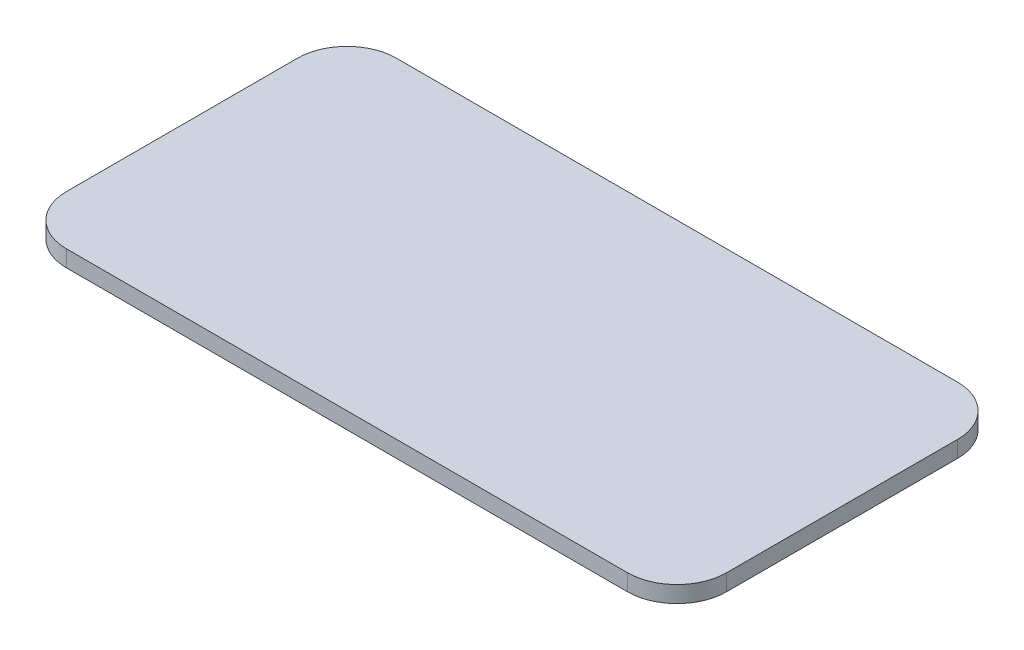
ISO-10303-21;
HEADER;
FILE_DESCRIPTION(('STEP AP214'),'2;1');
FILE_NAME('part.step','',(''),(''),'','','');
FILE_SCHEMA(('AUTOMOTIVE_DESIGN { 1 0 10303 214 1 1 1 1 }'));
ENDSEC;
DATA;
#1=APPLICATION_CONTEXT('core data for automotive mechanical design processes');
#2=APPLICATION_PROTOCOL_DEFINITION('international standard','automotive_design',2000,#1);
#3=PRODUCT_CONTEXT('',#1,'mechanical');
#4=PRODUCT('Part','Part','',(#3));
#5=PRODUCT_RELATED_PRODUCT_CATEGORY('part','',(#4));
#6=PRODUCT_DEFINITION_FORMATION('','',#4);
#7=PRODUCT_DEFINITION_CONTEXT('part definition',#1,'design');
#8=PRODUCT_DEFINITION('design','',#6,#7);
#9=PRODUCT_DEFINITION_SHAPE('','',#8);
#10=(LENGTH_UNIT() NAMED_UNIT(*) SI_UNIT(.MILLI.,.METRE.));
#11=(NAMED_UNIT(*) PLANE_ANGLE_UNIT() SI_UNIT($,.RADIAN.));
#12=(NAMED_UNIT(*) SI_UNIT($,.STERADIAN.) SOLID_ANGLE_UNIT());
#13=UNCERTAINTY_MEASURE_WITH_UNIT(LENGTH_MEASURE(1.E-05),#10,'distance_accuracy_value','');
#14=(GEOMETRIC_REPRESENTATION_CONTEXT(3) GLOBAL_UNCERTAINTY_ASSIGNED_CONTEXT((#13)) GLOBAL_UNIT_ASSIGNED_CONTEXT((#10,
#11,#12)) REPRESENTATION_CONTEXT('',''));
#15=CARTESIAN_POINT('',(0.,0.,0.));
#16=DIRECTION('',(0.,0.,1.));
#17=DIRECTION('',(1.,0.,0.));
#18=AXIS2_PLACEMENT_3D('',#15,#16,#17);
#19=CARTESIAN_POINT('',(0.,0.,0.));
#20=DIRECTION('',(0.,1.,0.));
#21=DIRECTION('',(0.,0.,1.));
#22=AXIS2_PLACEMENT_3D('',#19,#20,#21);
#23=PLANE('',#22);
#24=DIRECTION('',(-1.,0.,0.));
#25=VECTOR('',#24,1.);
#26=CARTESIAN_POINT('',(-95.015,0.,-45.015));
#27=LINE('',#26,#25);
#28=CARTESIAN_POINT('',(80.015,0.,-45.015));
#29=VERTEX_POINT('',#28);
#30=CARTESIAN_POINT('',(-80.015,0.,-45.015));
#31=VERTEX_POINT('',#30);
#32=EDGE_CURVE('E390',#29,#31,#27,.T.);
#33=ORIENTED_EDGE('',*,*,#32,.F.);
#34=CARTESIAN_POINT('',(80.015,0.,-30.015));
#35=DIRECTION('',(0.,1.,0.));
#36=DIRECTION('',(0.,0.,1.));
#37=AXIS2_PLACEMENT_3D('',#34,#35,#36);
#38=CIRCLE('',#37,15.);
#39=CARTESIAN_POINT('',(95.015,0.,-30.015));
#40=VERTEX_POINT('',#39);
#41=EDGE_CURVE('E11',#29,#40,#38,.F.);
#42=ORIENTED_EDGE('',*,*,#41,.T.);
#43=DIRECTION('',(0.,0.,-1.));
#44=VECTOR('',#43,1.);
#45=CARTESIAN_POINT('',(95.015,0.,-45.015));
#46=LINE('',#45,#44);
#47=CARTESIAN_POINT('',(95.015,0.,30.015));
#48=VERTEX_POINT('',#47);
#49=EDGE_CURVE('E402',#48,#40,#46,.T.);
#50=ORIENTED_EDGE('',*,*,#49,.F.);
#51=CARTESIAN_POINT('',(80.015,0.,30.015));
#52=DIRECTION('',(0.,1.,0.));
#53=DIRECTION('',(0.,0.,1.));
#54=AXIS2_PLACEMENT_3D('',#51,#52,#53);
#55=CIRCLE('',#54,15.);
#56=CARTESIAN_POINT('',(80.015,0.,45.015));
#57=VERTEX_POINT('',#56);
#58=EDGE_CURVE('E221',#48,#57,#55,.F.);
#59=ORIENTED_EDGE('',*,*,#58,.T.);
#60=DIRECTION('',(1.,0.,0.));
#61=VECTOR('',#60,1.);
#62=CARTESIAN_POINT('',(-95.015,0.,45.015));
#63=LINE('',#62,#61);
#64=CARTESIAN_POINT('',(-80.015,0.,45.015));
#65=VERTEX_POINT('',#64);
#66=EDGE_CURVE('E250',#65,#57,#63,.T.);
#67=ORIENTED_EDGE('',*,*,#66,.F.);
#68=CARTESIAN_POINT('',(-80.015,0.,30.015));
#69=DIRECTION('',(0.,1.,0.));
#70=DIRECTION('',(0.,0.,1.));
#71=AXIS2_PLACEMENT_3D('',#68,#69,#70);
#72=CIRCLE('',#71,15.);
#73=CARTESIAN_POINT('',(-95.015,0.,30.015));
#74=VERTEX_POINT('',#73);
#75=EDGE_CURVE('E383',#65,#74,#72,.F.);
#76=ORIENTED_EDGE('',*,*,#75,.T.);
#77=DIRECTION('',(0.,0.,1.));
#78=VECTOR('',#77,1.);
#79=CARTESIAN_POINT('',(-95.015,0.,-45.015));
#80=LINE('',#79,#78);
#81=CARTESIAN_POINT('',(-95.015,0.,-30.015));
#82=VERTEX_POINT('',#81);
#83=EDGE_CURVE('E392',#82,#74,#80,.T.);
#84=ORIENTED_EDGE('',*,*,#83,.F.);
#85=CARTESIAN_POINT('',(-80.015,0.,-30.015));
#86=DIRECTION('',(0.,1.,0.));
#87=DIRECTION('',(0.,0.,1.));
#88=AXIS2_PLACEMENT_3D('',#85,#86,#87);
#89=CIRCLE('',#88,15.);
#90=EDGE_CURVE('E57',#82,#31,#89,.F.);
#91=ORIENTED_EDGE('',*,*,#90,.T.);
#92=EDGE_LOOP('',(#33,#42,#50,#59,#67,#76,#84,#91));
#93=FACE_BOUND('',#92,.T.);
#94=DIRECTION('',(1.,0.,0.));
#95=VECTOR('',#94,1.);
#96=CARTESIAN_POINT('',(-92.015,0.,42.015));
#97=LINE('',#96,#95);
#98=CARTESIAN_POINT('',(-77.015,0.,42.015));
#99=VERTEX_POINT('',#98);
#100=CARTESIAN_POINT('',(77.015,0.,42.015));
#101=VERTEX_POINT('',#100);
#102=EDGE_CURVE('E215',#99,#101,#97,.T.);
#103=ORIENTED_EDGE('',*,*,#102,.T.);
#104=CARTESIAN_POINT('',(77.015,0.,27.015));
#105=DIRECTION('',(0.,1.,0.));
#106=DIRECTION('',(0.,0.,1.));
#107=AXIS2_PLACEMENT_3D('',#104,#105,#106);
#108=CIRCLE('',#107,15.);
#109=CARTESIAN_POINT('',(92.015,0.,27.015));
#110=VERTEX_POINT('',#109);
#111=EDGE_CURVE('E211',#101,#110,#108,.T.);
#112=ORIENTED_EDGE('',*,*,#111,.T.);
#113=DIRECTION('',(0.,0.,-1.));
#114=VECTOR('',#113,1.);
#115=CARTESIAN_POINT('',(92.015,0.,42.015));
#116=LINE('',#115,#114);
#117=CARTESIAN_POINT('',(92.015,0.,-27.015));
#118=VERTEX_POINT('',#117);
#119=EDGE_CURVE('E213',#110,#118,#116,.T.);
#120=ORIENTED_EDGE('',*,*,#119,.T.);
#121=CARTESIAN_POINT('',(77.015,0.,-27.015));
#122=DIRECTION('',(0.,1.,0.));
#123=DIRECTION('',(0.,0.,1.));
#124=AXIS2_PLACEMENT_3D('',#121,#122,#123);
#125=CIRCLE('',#124,15.);
#126=CARTESIAN_POINT('',(77.015,0.,-42.015));
#127=VERTEX_POINT('',#126);
#128=EDGE_CURVE('E361',#118,#127,#125,.T.);
#129=ORIENTED_EDGE('',*,*,#128,.T.);
#130=DIRECTION('',(-1.,0.,0.));
#131=VECTOR('',#130,1.);
#132=CARTESIAN_POINT('',(-92.015,0.,-42.015));
#133=LINE('',#132,#131);
#134=CARTESIAN_POINT('',(-77.015,0.,-42.015));
#135=VERTEX_POINT('',#134);
#136=EDGE_CURVE('E233',#127,#135,#133,.T.);
#137=ORIENTED_EDGE('',*,*,#136,.T.);
#138=CARTESIAN_POINT('',(-77.015,0.,-27.015));
#139=DIRECTION('',(0.,1.,0.));
#140=DIRECTION('',(0.,0.,1.));
#141=AXIS2_PLACEMENT_3D('',#138,#139,#140);
#142=CIRCLE('',#141,15.);
#143=CARTESIAN_POINT('',(-92.015,0.,-27.015));
#144=VERTEX_POINT('',#143);
#145=EDGE_CURVE('E367',#135,#144,#142,.T.);
#146=ORIENTED_EDGE('',*,*,#145,.T.);
#147=DIRECTION('',(0.,0.,1.));
#148=VECTOR('',#147,1.);
#149=CARTESIAN_POINT('',(-92.015,0.,42.015));
#150=LINE('',#149,#148);
#151=CARTESIAN_POINT('',(-92.015,0.,27.015));
#152=VERTEX_POINT('',#151);
#153=EDGE_CURVE('E439',#144,#152,#150,.T.);
#154=ORIENTED_EDGE('',*,*,#153,.T.);
#155=CARTESIAN_POINT('',(-77.015,0.,27.015));
#156=DIRECTION('',(0.,1.,0.));
#157=DIRECTION('',(0.,0.,1.));
#158=AXIS2_PLACEMENT_3D('',#155,#156,#157);
#159=CIRCLE('',#158,15.);
#160=EDGE_CURVE('E373',#152,#99,#159,.T.);
#161=ORIENTED_EDGE('',*,*,#160,.T.);
#162=EDGE_LOOP('',(#103,#112,#120,#129,#137,#146,#154,#161));
#163=FACE_BOUND('',#162,.T.);
#164=ADVANCED_FACE('F48',(#93,#163),#23,.F.);
#165=CARTESIAN_POINT('',(95.015,4.,-45.015));
#166=DIRECTION('',(-1.,0.,0.));
#167=DIRECTION('',(0.,0.,1.));
#168=AXIS2_PLACEMENT_3D('',#165,#166,#167);
#169=PLANE('',#168);
#170=ORIENTED_EDGE('',*,*,#49,.T.);
#171=DIRECTION('',(0.,-1.,0.));
#172=VECTOR('',#171,1.);
#173=CARTESIAN_POINT('',(95.015,4.,-30.015));
#174=LINE('',#173,#172);
#175=CARTESIAN_POINT('',(95.015,4.,-30.015));
#176=VERTEX_POINT('',#175);
#177=EDGE_CURVE('E281',#40,#176,#174,.F.);
#178=ORIENTED_EDGE('',*,*,#177,.T.);
#179=DIRECTION('',(0.,0.,-1.));
#180=VECTOR('',#179,1.);
#181=CARTESIAN_POINT('',(95.015,4.,-45.015));
#182=LINE('',#181,#180);
#183=CARTESIAN_POINT('',(95.015,4.,30.015));
#184=VERTEX_POINT('',#183);
#185=EDGE_CURVE('E418',#184,#176,#182,.T.);
#186=ORIENTED_EDGE('',*,*,#185,.F.);
#187=DIRECTION('',(0.,-1.,0.));
#188=VECTOR('',#187,1.);
#189=CARTESIAN_POINT('',(95.015,4.,30.015));
#190=LINE('',#189,#188);
#191=EDGE_CURVE('E277',#184,#48,#190,.T.);
#192=ORIENTED_EDGE('',*,*,#191,.T.);
#193=EDGE_LOOP('',(#170,#178,#186,#192));
#194=FACE_BOUND('',#193,.T.);
#195=ADVANCED_FACE('F530',(#194),#169,.F.);
#196=CARTESIAN_POINT('',(-95.015,4.,-45.015));
#197=DIRECTION('',(0.,0.,1.));
#198=DIRECTION('',(1.,0.,0.));
#199=AXIS2_PLACEMENT_3D('',#196,#197,#198);
#200=PLANE('',#199);
#201=DIRECTION('',(-1.,0.,0.));
#202=VECTOR('',#201,1.);
#203=CARTESIAN_POINT('',(-95.015,4.,-45.015));
#204=LINE('',#203,#202);
#205=CARTESIAN_POINT('',(80.015,4.,-45.015));
#206=VERTEX_POINT('',#205);
#207=CARTESIAN_POINT('',(-80.015,4.,-45.015));
#208=VERTEX_POINT('',#207);
#209=EDGE_CURVE('E411',#206,#208,#204,.T.);
#210=ORIENTED_EDGE('',*,*,#209,.F.);
#211=DIRECTION('',(0.,-1.,0.));
#212=VECTOR('',#211,1.);
#213=CARTESIAN_POINT('',(80.015,4.,-45.015));
#214=LINE('',#213,#212);
#215=EDGE_CURVE('E273',#206,#29,#214,.T.);
#216=ORIENTED_EDGE('',*,*,#215,.T.);
#217=ORIENTED_EDGE('',*,*,#32,.T.);
#218=DIRECTION('',(0.,-1.,0.));
#219=VECTOR('',#218,1.);
#220=CARTESIAN_POINT('',(-80.015,4.,-45.015));
#221=LINE('',#220,#219);
#222=EDGE_CURVE('E270',#31,#208,#221,.F.);
#223=ORIENTED_EDGE('',*,*,#222,.T.);
#224=EDGE_LOOP('',(#210,#216,#217,#223));
#225=FACE_BOUND('',#224,.T.);
#226=ADVANCED_FACE('F398',(#225),#200,.F.);
#227=CARTESIAN_POINT('',(-95.015,4.,-45.015));
#228=DIRECTION('',(1.,0.,0.));
#229=DIRECTION('',(0.,0.,-1.));
#230=AXIS2_PLACEMENT_3D('',#227,#228,#229);
#231=PLANE('',#230);
#232=DIRECTION('',(0.,0.,1.));
#233=VECTOR('',#232,1.);
#234=CARTESIAN_POINT('',(-95.015,4.,-45.015));
#235=LINE('',#234,#233);
#236=CARTESIAN_POINT('',(-95.015,4.,-30.015));
#237=VERTEX_POINT('',#236);
#238=CARTESIAN_POINT('',(-95.015,4.,30.015));
#239=VERTEX_POINT('',#238);
#240=EDGE_CURVE('E247',#237,#239,#235,.T.);
#241=ORIENTED_EDGE('',*,*,#240,.F.);
#242=DIRECTION('',(0.,-1.,0.));
#243=VECTOR('',#242,1.);
#244=CARTESIAN_POINT('',(-95.015,4.,-30.015));
#245=LINE('',#244,#243);
#246=EDGE_CURVE('E294',#237,#82,#245,.T.);
#247=ORIENTED_EDGE('',*,*,#246,.T.);
#248=ORIENTED_EDGE('',*,*,#83,.T.);
#249=DIRECTION('',(0.,-1.,0.));
#250=VECTOR('',#249,1.);
#251=CARTESIAN_POINT('',(-95.015,4.,30.015));
#252=LINE('',#251,#250);
#253=EDGE_CURVE('E291',#74,#239,#252,.F.);
#254=ORIENTED_EDGE('',*,*,#253,.T.);
#255=EDGE_LOOP('',(#241,#247,#248,#254));
#256=FACE_BOUND('',#255,.T.);
#257=ADVANCED_FACE('F413',(#256),#231,.F.);
#258=CARTESIAN_POINT('',(-95.015,4.,45.015));
#259=DIRECTION('',(0.,0.,-1.));
#260=DIRECTION('',(-1.,0.,0.));
#261=AXIS2_PLACEMENT_3D('',#258,#259,#260);
#262=PLANE('',#261);
#263=DIRECTION('',(1.,0.,0.));
#264=VECTOR('',#263,1.);
#265=CARTESIAN_POINT('',(-95.015,4.,45.015));
#266=LINE('',#265,#264);
#267=CARTESIAN_POINT('',(-80.015,4.,45.015));
#268=VERTEX_POINT('',#267);
#269=CARTESIAN_POINT('',(80.015,4.,45.015));
#270=VERTEX_POINT('',#269);
#271=EDGE_CURVE('E240',#268,#270,#266,.T.);
#272=ORIENTED_EDGE('',*,*,#271,.F.);
#273=DIRECTION('',(0.,-1.,0.));
#274=VECTOR('',#273,1.);
#275=CARTESIAN_POINT('',(-80.015,4.,45.015));
#276=LINE('',#275,#274);
#277=EDGE_CURVE('E307',#268,#65,#276,.T.);
#278=ORIENTED_EDGE('',*,*,#277,.T.);
#279=ORIENTED_EDGE('',*,*,#66,.T.);
#280=DIRECTION('',(0.,-1.,0.));
#281=VECTOR('',#280,1.);
#282=CARTESIAN_POINT('',(80.015,4.,45.015));
#283=LINE('',#282,#281);
#284=EDGE_CURVE('E304',#57,#270,#283,.F.);
#285=ORIENTED_EDGE('',*,*,#284,.T.);
#286=EDGE_LOOP('',(#272,#278,#279,#285));
#287=FACE_BOUND('',#286,.T.);
#288=ADVANCED_FACE('F540',(#287),#262,.F.);
#289=CARTESIAN_POINT('',(92.015,4.,42.015));
#290=DIRECTION('',(-1.,0.,0.));
#291=DIRECTION('',(0.,0.,1.));
#292=AXIS2_PLACEMENT_3D('',#289,#290,#291);
#293=PLANE('',#292);
#294=DIRECTION('',(0.,0.,-1.));
#295=VECTOR('',#294,1.);
#296=CARTESIAN_POINT('',(92.015,4.,42.015));
#297=LINE('',#296,#295);
#298=CARTESIAN_POINT('',(92.015,4.,27.015));
#299=VERTEX_POINT('',#298);
#300=CARTESIAN_POINT('',(92.015,4.,-27.015));
#301=VERTEX_POINT('',#300);
#302=EDGE_CURVE('E438',#299,#301,#297,.T.);
#303=ORIENTED_EDGE('',*,*,#302,.T.);
#304=DIRECTION('',(0.,-1.,0.));
#305=VECTOR('',#304,1.);
#306=CARTESIAN_POINT('',(92.015,0.,-27.015));
#307=LINE('',#306,#305);
#308=EDGE_CURVE('E231',#301,#118,#307,.T.);
#309=ORIENTED_EDGE('',*,*,#308,.T.);
#310=ORIENTED_EDGE('',*,*,#119,.F.);
#311=DIRECTION('',(0.,-1.,0.));
#312=VECTOR('',#311,1.);
#313=CARTESIAN_POINT('',(92.015,4.,27.015));
#314=LINE('',#313,#312);
#315=EDGE_CURVE('E228',#110,#299,#314,.F.);
#316=ORIENTED_EDGE('',*,*,#315,.T.);
#317=EDGE_LOOP('',(#303,#309,#310,#316));
#318=FACE_BOUND('',#317,.T.);
#319=ADVANCED_FACE('F227',(#318),#293,.T.);
#320=CARTESIAN_POINT('',(-92.015,4.,-42.015));
#321=DIRECTION('',(0.,0.,1.));
#322=DIRECTION('',(1.,0.,0.));
#323=AXIS2_PLACEMENT_3D('',#320,#321,#322);
#324=PLANE('',#323);
#325=ORIENTED_EDGE('',*,*,#136,.F.);
#326=DIRECTION('',(0.,-1.,0.));
#327=VECTOR('',#326,1.);
#328=CARTESIAN_POINT('',(77.015,4.,-42.015));
#329=LINE('',#328,#327);
#330=CARTESIAN_POINT('',(77.015,4.,-42.015));
#331=VERTEX_POINT('',#330);
#332=EDGE_CURVE('E256',#127,#331,#329,.F.);
#333=ORIENTED_EDGE('',*,*,#332,.T.);
#334=DIRECTION('',(-1.,0.,0.));
#335=VECTOR('',#334,1.);
#336=CARTESIAN_POINT('',(-92.015,4.,-42.015));
#337=LINE('',#336,#335);
#338=CARTESIAN_POINT('',(-77.015,4.,-42.015));
#339=VERTEX_POINT('',#338);
#340=EDGE_CURVE('E453',#331,#339,#337,.T.);
#341=ORIENTED_EDGE('',*,*,#340,.T.);
#342=DIRECTION('',(0.,-1.,0.));
#343=VECTOR('',#342,1.);
#344=CARTESIAN_POINT('',(-77.015,0.,-42.015));
#345=LINE('',#344,#343);
#346=EDGE_CURVE('E244',#339,#135,#345,.T.);
#347=ORIENTED_EDGE('',*,*,#346,.T.);
#348=EDGE_LOOP('',(#325,#333,#341,#347));
#349=FACE_BOUND('',#348,.T.);
#350=ADVANCED_FACE('F731',(#349),#324,.T.);
#351=CARTESIAN_POINT('',(-92.015,4.,42.015));
#352=DIRECTION('',(1.,0.,0.));
#353=DIRECTION('',(0.,0.,-1.));
#354=AXIS2_PLACEMENT_3D('',#351,#352,#353);
#355=PLANE('',#354);
#356=ORIENTED_EDGE('',*,*,#153,.F.);
#357=DIRECTION('',(0.,-1.,0.));
#358=VECTOR('',#357,1.);
#359=CARTESIAN_POINT('',(-92.015,4.,-27.015));
#360=LINE('',#359,#358);
#361=CARTESIAN_POINT('',(-92.015,4.,-27.015));
#362=VERTEX_POINT('',#361);
#363=EDGE_CURVE('E288',#144,#362,#360,.F.);
#364=ORIENTED_EDGE('',*,*,#363,.T.);
#365=DIRECTION('',(0.,0.,1.));
#366=VECTOR('',#365,1.);
#367=CARTESIAN_POINT('',(-92.015,4.,42.015));
#368=LINE('',#367,#366);
#369=CARTESIAN_POINT('',(-92.015,4.,27.015));
#370=VERTEX_POINT('',#369);
#371=EDGE_CURVE('E449',#362,#370,#368,.T.);
#372=ORIENTED_EDGE('',*,*,#371,.T.);
#373=DIRECTION('',(0.,-1.,0.));
#374=VECTOR('',#373,1.);
#375=CARTESIAN_POINT('',(-92.015,0.,27.015));
#376=LINE('',#375,#374);
#377=EDGE_CURVE('E284',#370,#152,#376,.T.);
#378=ORIENTED_EDGE('',*,*,#377,.T.);
#379=EDGE_LOOP('',(#356,#364,#372,#378));
#380=FACE_BOUND('',#379,.T.);
#381=ADVANCED_FACE('F722',(#380),#355,.T.);
#382=CARTESIAN_POINT('',(-92.015,4.,42.015));
#383=DIRECTION('',(0.,0.,-1.));
#384=DIRECTION('',(-1.,0.,0.));
#385=AXIS2_PLACEMENT_3D('',#382,#383,#384);
#386=PLANE('',#385);
#387=ORIENTED_EDGE('',*,*,#102,.F.);
#388=DIRECTION('',(0.,-1.,0.));
#389=VECTOR('',#388,1.);
#390=CARTESIAN_POINT('',(-77.015,4.,42.015));
#391=LINE('',#390,#389);
#392=CARTESIAN_POINT('',(-77.015,4.,42.015));
#393=VERTEX_POINT('',#392);
#394=EDGE_CURVE('E301',#99,#393,#391,.F.);
#395=ORIENTED_EDGE('',*,*,#394,.T.);
#396=DIRECTION('',(1.,0.,0.));
#397=VECTOR('',#396,1.);
#398=CARTESIAN_POINT('',(-92.015,4.,42.015));
#399=LINE('',#398,#397);
#400=CARTESIAN_POINT('',(77.015,4.,42.015));
#401=VERTEX_POINT('',#400);
#402=EDGE_CURVE('E424',#393,#401,#399,.T.);
#403=ORIENTED_EDGE('',*,*,#402,.T.);
#404=DIRECTION('',(0.,-1.,0.));
#405=VECTOR('',#404,1.);
#406=CARTESIAN_POINT('',(77.015,0.,42.015));
#407=LINE('',#406,#405);
#408=EDGE_CURVE('E298',#401,#101,#407,.T.);
#409=ORIENTED_EDGE('',*,*,#408,.T.);
#410=EDGE_LOOP('',(#387,#395,#403,#409));
#411=FACE_BOUND('',#410,.T.);
#412=ADVANCED_FACE('F712',(#411),#386,.T.);
#413=CARTESIAN_POINT('',(0.,4.,0.));
#414=DIRECTION('',(0.,1.,0.));
#415=DIRECTION('',(0.,0.,1.));
#416=AXIS2_PLACEMENT_3D('',#413,#414,#415);
#417=PLANE('',#416);
#418=ORIENTED_EDGE('',*,*,#340,.F.);
#419=CARTESIAN_POINT('',(77.015,4.,-27.015));
#420=DIRECTION('',(0.,1.,0.));
#421=DIRECTION('',(0.,0.,1.));
#422=AXIS2_PLACEMENT_3D('',#419,#420,#421);
#423=CIRCLE('',#422,15.);
#424=EDGE_CURVE('E267',#331,#301,#423,.F.);
#425=ORIENTED_EDGE('',*,*,#424,.T.);
#426=ORIENTED_EDGE('',*,*,#302,.F.);
#427=CARTESIAN_POINT('',(77.015,4.,27.015));
#428=DIRECTION('',(0.,1.,0.));
#429=DIRECTION('',(0.,0.,1.));
#430=AXIS2_PLACEMENT_3D('',#427,#428,#429);
#431=CIRCLE('',#430,15.);
#432=EDGE_CURVE('E238',#299,#401,#431,.F.);
#433=ORIENTED_EDGE('',*,*,#432,.T.);
#434=ORIENTED_EDGE('',*,*,#402,.F.);
#435=CARTESIAN_POINT('',(-77.015,4.,27.015));
#436=DIRECTION('',(0.,1.,0.));
#437=DIRECTION('',(0.,0.,1.));
#438=AXIS2_PLACEMENT_3D('',#435,#436,#437);
#439=CIRCLE('',#438,15.);
#440=EDGE_CURVE('E261',#393,#370,#439,.F.);
#441=ORIENTED_EDGE('',*,*,#440,.T.);
#442=ORIENTED_EDGE('',*,*,#371,.F.);
#443=CARTESIAN_POINT('',(-77.015,4.,-27.015));
#444=DIRECTION('',(0.,1.,0.));
#445=DIRECTION('',(0.,0.,1.));
#446=AXIS2_PLACEMENT_3D('',#443,#444,#445);
#447=CIRCLE('',#446,15.);
#448=EDGE_CURVE('E264',#362,#339,#447,.F.);
#449=ORIENTED_EDGE('',*,*,#448,.T.);
#450=EDGE_LOOP('',(#418,#425,#426,#433,#434,#441,#442,#449));
#451=FACE_BOUND('',#450,.T.);
#452=ADVANCED_FACE('F526',(#451),#417,.F.);
#453=DIRECTION('',(-1.,0.,0.));
#454=VECTOR('',#453,1.);
#455=CARTESIAN_POINT('',(-100.,4.,-50.));
#456=LINE('',#455,#454);
#457=CARTESIAN_POINT('',(85.,4.,-50.));
#458=VERTEX_POINT('',#457);
#459=CARTESIAN_POINT('',(-85.,4.,-50.));
#460=VERTEX_POINT('',#459);
#461=EDGE_CURVE('E467',#458,#460,#456,.T.);
#462=ORIENTED_EDGE('',*,*,#461,.F.);
#463=CARTESIAN_POINT('',(85.,4.,-35.));
#464=DIRECTION('',(0.,1.,0.));
#465=DIRECTION('',(0.,0.,1.));
#466=AXIS2_PLACEMENT_3D('',#463,#464,#465);
#467=CIRCLE('',#466,15.);
#468=CARTESIAN_POINT('',(100.,4.,-35.));
#469=VERTEX_POINT('',#468);
#470=EDGE_CURVE('E327',#458,#469,#467,.F.);
#471=ORIENTED_EDGE('',*,*,#470,.T.);
#472=DIRECTION('',(0.,0.,-1.));
#473=VECTOR('',#472,1.);
#474=CARTESIAN_POINT('',(100.,4.,-50.));
#475=LINE('',#474,#473);
#476=CARTESIAN_POINT('',(100.,4.,35.));
#477=VERTEX_POINT('',#476);
#478=EDGE_CURVE('E471',#477,#469,#475,.T.);
#479=ORIENTED_EDGE('',*,*,#478,.F.);
#480=CARTESIAN_POINT('',(85.,4.,35.));
#481=DIRECTION('',(0.,1.,0.));
#482=DIRECTION('',(0.,0.,1.));
#483=AXIS2_PLACEMENT_3D('',#480,#481,#482);
#484=CIRCLE('',#483,15.);
#485=CARTESIAN_POINT('',(85.,4.,50.));
#486=VERTEX_POINT('',#485);
#487=EDGE_CURVE('E324',#477,#486,#484,.F.);
#488=ORIENTED_EDGE('',*,*,#487,.T.);
#489=DIRECTION('',(1.,0.,0.));
#490=VECTOR('',#489,1.);
#491=CARTESIAN_POINT('',(-100.,4.,50.));
#492=LINE('',#491,#490);
#493=CARTESIAN_POINT('',(-85.,4.,50.));
#494=VERTEX_POINT('',#493);
#495=EDGE_CURVE('E459',#494,#486,#492,.T.);
#496=ORIENTED_EDGE('',*,*,#495,.F.);
#497=CARTESIAN_POINT('',(-85.,4.,35.));
#498=DIRECTION('',(0.,1.,0.));
#499=DIRECTION('',(0.,0.,1.));
#500=AXIS2_PLACEMENT_3D('',#497,#498,#499);
#501=CIRCLE('',#500,15.);
#502=CARTESIAN_POINT('',(-100.,4.,35.));
#503=VERTEX_POINT('',#502);
#504=EDGE_CURVE('E318',#494,#503,#501,.F.);
#505=ORIENTED_EDGE('',*,*,#504,.T.);
#506=DIRECTION('',(0.,0.,1.));
#507=VECTOR('',#506,1.);
#508=CARTESIAN_POINT('',(-100.,4.,-50.));
#509=LINE('',#508,#507);
#510=CARTESIAN_POINT('',(-100.,4.,-35.));
#511=VERTEX_POINT('',#510);
#512=EDGE_CURVE('E463',#511,#503,#509,.T.);
#513=ORIENTED_EDGE('',*,*,#512,.F.);
#514=CARTESIAN_POINT('',(-85.,4.,-35.));
#515=DIRECTION('',(0.,1.,0.));
#516=DIRECTION('',(0.,0.,1.));
#517=AXIS2_PLACEMENT_3D('',#514,#515,#516);
#518=CIRCLE('',#517,15.);
#519=EDGE_CURVE('E321',#511,#460,#518,.F.);
#520=ORIENTED_EDGE('',*,*,#519,.T.);
#521=EDGE_LOOP('',(#462,#471,#479,#488,#496,#505,#513,#520));
#522=FACE_BOUND('',#521,.T.);
#523=ORIENTED_EDGE('',*,*,#240,.T.);
#524=CARTESIAN_POINT('',(-80.015,4.,30.015));
#525=DIRECTION('',(0.,1.,0.));
#526=DIRECTION('',(0.,0.,1.));
#527=AXIS2_PLACEMENT_3D('',#524,#525,#526);
#528=CIRCLE('',#527,15.);
#529=EDGE_CURVE('E376',#239,#268,#528,.T.);
#530=ORIENTED_EDGE('',*,*,#529,.T.);
#531=ORIENTED_EDGE('',*,*,#271,.T.);
#532=CARTESIAN_POINT('',(80.015,4.,30.015));
#533=DIRECTION('',(0.,1.,0.));
#534=DIRECTION('',(0.,0.,1.));
#535=AXIS2_PLACEMENT_3D('',#532,#533,#534);
#536=CIRCLE('',#535,15.);
#537=EDGE_CURVE('E222',#270,#184,#536,.T.);
#538=ORIENTED_EDGE('',*,*,#537,.T.);
#539=ORIENTED_EDGE('',*,*,#185,.T.);
#540=CARTESIAN_POINT('',(80.015,4.,-30.015));
#541=DIRECTION('',(0.,1.,0.));
#542=DIRECTION('',(0.,0.,1.));
#543=AXIS2_PLACEMENT_3D('',#540,#541,#542);
#544=CIRCLE('',#543,15.);
#545=EDGE_CURVE('E364',#176,#206,#544,.T.);
#546=ORIENTED_EDGE('',*,*,#545,.T.);
#547=ORIENTED_EDGE('',*,*,#209,.T.);
#548=CARTESIAN_POINT('',(-80.015,4.,-30.015));
#549=DIRECTION('',(0.,1.,0.));
#550=DIRECTION('',(0.,0.,1.));
#551=AXIS2_PLACEMENT_3D('',#548,#549,#550);
#552=CIRCLE('',#551,15.);
#553=EDGE_CURVE('E370',#208,#237,#552,.T.);
#554=ORIENTED_EDGE('',*,*,#553,.T.);
#555=EDGE_LOOP('',(#523,#530,#531,#538,#539,#546,#547,#554));
#556=FACE_BOUND('',#555,.T.);
#557=ADVANCED_FACE('F409',(#522,#556),#417,.F.);
#558=CARTESIAN_POINT('',(100.,9.,-50.));
#559=DIRECTION('',(-1.,0.,0.));
#560=DIRECTION('',(0.,0.,1.));
#561=AXIS2_PLACEMENT_3D('',#558,#559,#560);
#562=PLANE('',#561);
#563=ORIENTED_EDGE('',*,*,#478,.T.);
#564=DIRECTION('',(0.,-1.,0.));
#565=VECTOR('',#564,1.);
#566=CARTESIAN_POINT('',(100.,9.,-35.));
#567=LINE('',#566,#565);
#568=CARTESIAN_POINT('',(100.,9.,-35.));
#569=VERTEX_POINT('',#568);
#570=EDGE_CURVE('E334',#469,#569,#567,.F.);
#571=ORIENTED_EDGE('',*,*,#570,.T.);
#572=DIRECTION('',(0.,0.,-1.));
#573=VECTOR('',#572,1.);
#574=CARTESIAN_POINT('',(100.,9.,-50.));
#575=LINE('',#574,#573);
#576=CARTESIAN_POINT('',(100.,9.,35.));
#577=VERTEX_POINT('',#576);
#578=EDGE_CURVE('E462',#577,#569,#575,.T.);
#579=ORIENTED_EDGE('',*,*,#578,.F.);
#580=DIRECTION('',(0.,-1.,0.));
#581=VECTOR('',#580,1.);
#582=CARTESIAN_POINT('',(100.,9.,35.));
#583=LINE('',#582,#581);
#584=EDGE_CURVE('E330',#577,#477,#583,.T.);
#585=ORIENTED_EDGE('',*,*,#584,.T.);
#586=EDGE_LOOP('',(#563,#571,#579,#585));
#587=FACE_BOUND('',#586,.T.);
#588=ADVANCED_FACE('F518',(#587),#562,.F.);
#589=CARTESIAN_POINT('',(-100.,9.,-50.));
#590=DIRECTION('',(0.,0.,1.));
#591=DIRECTION('',(1.,0.,0.));
#592=AXIS2_PLACEMENT_3D('',#589,#590,#591);
#593=PLANE('',#592);
#594=DIRECTION('',(-1.,0.,0.));
#595=VECTOR('',#594,1.);
#596=CARTESIAN_POINT('',(-100.,9.,-50.));
#597=LINE('',#596,#595);
#598=CARTESIAN_POINT('',(85.,9.,-50.));
#599=VERTEX_POINT('',#598);
#600=CARTESIAN_POINT('',(-85.,9.,-50.));
#601=VERTEX_POINT('',#600);
#602=EDGE_CURVE('E480',#599,#601,#597,.T.);
#603=ORIENTED_EDGE('',*,*,#602,.F.);
#604=DIRECTION('',(0.,-1.,0.));
#605=VECTOR('',#604,1.);
#606=CARTESIAN_POINT('',(85.,9.,-50.));
#607=LINE('',#606,#605);
#608=EDGE_CURVE('E314',#599,#458,#607,.T.);
#609=ORIENTED_EDGE('',*,*,#608,.T.);
#610=ORIENTED_EDGE('',*,*,#461,.T.);
#611=DIRECTION('',(0.,-1.,0.));
#612=VECTOR('',#611,1.);
#613=CARTESIAN_POINT('',(-85.,9.,-50.));
#614=LINE('',#613,#612);
#615=EDGE_CURVE('E311',#460,#601,#614,.F.);
#616=ORIENTED_EDGE('',*,*,#615,.T.);
#617=EDGE_LOOP('',(#603,#609,#610,#616));
#618=FACE_BOUND('',#617,.T.);
#619=ADVANCED_FACE('F499',(#618),#593,.F.);
#620=CARTESIAN_POINT('',(-100.,9.,-50.));
#621=DIRECTION('',(1.,0.,0.));
#622=DIRECTION('',(0.,0.,-1.));
#623=AXIS2_PLACEMENT_3D('',#620,#621,#622);
#624=PLANE('',#623);
#625=DIRECTION('',(0.,0.,1.));
#626=VECTOR('',#625,1.);
#627=CARTESIAN_POINT('',(-100.,9.,-50.));
#628=LINE('',#627,#626);
#629=CARTESIAN_POINT('',(-100.,9.,-35.));
#630=VERTEX_POINT('',#629);
#631=CARTESIAN_POINT('',(-100.,9.,35.));
#632=VERTEX_POINT('',#631);
#633=EDGE_CURVE('E477',#630,#632,#628,.T.);
#634=ORIENTED_EDGE('',*,*,#633,.F.);
#635=DIRECTION('',(0.,-1.,0.));
#636=VECTOR('',#635,1.);
#637=CARTESIAN_POINT('',(-100.,9.,-35.));
#638=LINE('',#637,#636);
#639=EDGE_CURVE('E357',#630,#511,#638,.T.);
#640=ORIENTED_EDGE('',*,*,#639,.T.);
#641=ORIENTED_EDGE('',*,*,#512,.T.);
#642=DIRECTION('',(0.,-1.,0.));
#643=VECTOR('',#642,1.);
#644=CARTESIAN_POINT('',(-100.,9.,35.));
#645=LINE('',#644,#643);
#646=EDGE_CURVE('E354',#503,#632,#645,.F.);
#647=ORIENTED_EDGE('',*,*,#646,.T.);
#648=EDGE_LOOP('',(#634,#640,#641,#647));
#649=FACE_BOUND('',#648,.T.);
#650=ADVANCED_FACE('F510',(#649),#624,.F.);
#651=CARTESIAN_POINT('',(-100.,9.,50.));
#652=DIRECTION('',(0.,0.,-1.));
#653=DIRECTION('',(-1.,0.,0.));
#654=AXIS2_PLACEMENT_3D('',#651,#652,#653);
#655=PLANE('',#654);
#656=ORIENTED_EDGE('',*,*,#495,.T.);
#657=DIRECTION('',(0.,-1.,0.));
#658=VECTOR('',#657,1.);
#659=CARTESIAN_POINT('',(85.,9.,50.));
#660=LINE('',#659,#658);
#661=CARTESIAN_POINT('',(85.,9.,50.));
#662=VERTEX_POINT('',#661);
#663=EDGE_CURVE('E64',#486,#662,#660,.F.);
#664=ORIENTED_EDGE('',*,*,#663,.T.);
#665=DIRECTION('',(1.,0.,0.));
#666=VECTOR('',#665,1.);
#667=CARTESIAN_POINT('',(-100.,9.,50.));
#668=LINE('',#667,#666);
#669=CARTESIAN_POINT('',(-85.,9.,50.));
#670=VERTEX_POINT('',#669);
#671=EDGE_CURVE('E234',#670,#662,#668,.T.);
#672=ORIENTED_EDGE('',*,*,#671,.F.);
#673=DIRECTION('',(0.,-1.,0.));
#674=VECTOR('',#673,1.);
#675=CARTESIAN_POINT('',(-85.,9.,50.));
#676=LINE('',#675,#674);
#677=EDGE_CURVE('E348',#670,#494,#676,.T.);
#678=ORIENTED_EDGE('',*,*,#677,.T.);
#679=EDGE_LOOP('',(#656,#664,#672,#678));
#680=FACE_BOUND('',#679,.T.);
#681=ADVANCED_FACE('F515',(#680),#655,.F.);
#682=CARTESIAN_POINT('',(0.,9.,0.));
#683=DIRECTION('',(0.,1.,0.));
#684=DIRECTION('',(0.,0.,1.));
#685=AXIS2_PLACEMENT_3D('',#682,#683,#684);
#686=PLANE('',#685);
#687=ORIENTED_EDGE('',*,*,#578,.T.);
#688=CARTESIAN_POINT('',(85.,9.,-35.));
#689=DIRECTION('',(0.,1.,0.));
#690=DIRECTION('',(0.,0.,1.));
#691=AXIS2_PLACEMENT_3D('',#688,#689,#690);
#692=CIRCLE('',#691,15.);
#693=EDGE_CURVE('E345',#569,#599,#692,.T.);
#694=ORIENTED_EDGE('',*,*,#693,.T.);
#695=ORIENTED_EDGE('',*,*,#602,.T.);
#696=CARTESIAN_POINT('',(-85.,9.,-35.));
#697=DIRECTION('',(0.,1.,0.));
#698=DIRECTION('',(0.,0.,1.));
#699=AXIS2_PLACEMENT_3D('',#696,#697,#698);
#700=CIRCLE('',#699,15.);
#701=EDGE_CURVE('E339',#601,#630,#700,.T.);
#702=ORIENTED_EDGE('',*,*,#701,.T.);
#703=ORIENTED_EDGE('',*,*,#633,.T.);
#704=CARTESIAN_POINT('',(-85.,9.,35.));
#705=DIRECTION('',(0.,1.,0.));
#706=DIRECTION('',(0.,0.,1.));
#707=AXIS2_PLACEMENT_3D('',#704,#705,#706);
#708=CIRCLE('',#707,15.);
#709=EDGE_CURVE('E71',#632,#670,#708,.T.);
#710=ORIENTED_EDGE('',*,*,#709,.T.);
#711=ORIENTED_EDGE('',*,*,#671,.T.);
#712=CARTESIAN_POINT('',(85.,9.,35.));
#713=DIRECTION('',(0.,1.,0.));
#714=DIRECTION('',(0.,0.,1.));
#715=AXIS2_PLACEMENT_3D('',#712,#713,#714);
#716=CIRCLE('',#715,15.);
#717=EDGE_CURVE('E342',#662,#577,#716,.T.);
#718=ORIENTED_EDGE('',*,*,#717,.T.);
#719=EDGE_LOOP('',(#687,#694,#695,#702,#703,#710,#711,#718));
#720=FACE_BOUND('',#719,.T.);
#721=ADVANCED_FACE('F488',(#720),#686,.T.);
#722=CARTESIAN_POINT('',(77.015,4.,-27.015));
#723=DIRECTION('',(0.,1.,0.));
#724=DIRECTION('',(0.,0.,1.));
#725=AXIS2_PLACEMENT_3D('',#722,#723,#724);
#726=CYLINDRICAL_SURFACE('',#725,15.);
#727=ORIENTED_EDGE('',*,*,#424,.F.);
#728=ORIENTED_EDGE('',*,*,#332,.F.);
#729=ORIENTED_EDGE('',*,*,#128,.F.);
#730=ORIENTED_EDGE('',*,*,#308,.F.);
#731=EDGE_LOOP('',(#727,#728,#729,#730));
#732=FACE_BOUND('',#731,.T.);
#733=ADVANCED_FACE('F547',(#732),#726,.F.);
#734=CARTESIAN_POINT('',(80.015,4.,-30.015));
#735=DIRECTION('',(0.,-1.,0.));
#736=DIRECTION('',(0.,0.,-1.));
#737=AXIS2_PLACEMENT_3D('',#734,#735,#736);
#738=CYLINDRICAL_SURFACE('',#737,15.);
#739=ORIENTED_EDGE('',*,*,#545,.F.);
#740=ORIENTED_EDGE('',*,*,#177,.F.);
#741=ORIENTED_EDGE('',*,*,#41,.F.);
#742=ORIENTED_EDGE('',*,*,#215,.F.);
#743=EDGE_LOOP('',(#739,#740,#741,#742));
#744=FACE_BOUND('',#743,.T.);
#745=ADVANCED_FACE('F550',(#744),#738,.T.);
#746=CARTESIAN_POINT('',(-77.015,4.,-27.015));
#747=DIRECTION('',(0.,1.,0.));
#748=DIRECTION('',(0.,0.,1.));
#749=AXIS2_PLACEMENT_3D('',#746,#747,#748);
#750=CYLINDRICAL_SURFACE('',#749,15.);
#751=ORIENTED_EDGE('',*,*,#448,.F.);
#752=ORIENTED_EDGE('',*,*,#363,.F.);
#753=ORIENTED_EDGE('',*,*,#145,.F.);
#754=ORIENTED_EDGE('',*,*,#346,.F.);
#755=EDGE_LOOP('',(#751,#752,#753,#754));
#756=FACE_BOUND('',#755,.T.);
#757=ADVANCED_FACE('F554',(#756),#750,.F.);
#758=CARTESIAN_POINT('',(-80.015,4.,-30.015));
#759=DIRECTION('',(0.,-1.,0.));
#760=DIRECTION('',(0.,0.,-1.));
#761=AXIS2_PLACEMENT_3D('',#758,#759,#760);
#762=CYLINDRICAL_SURFACE('',#761,15.);
#763=ORIENTED_EDGE('',*,*,#553,.F.);
#764=ORIENTED_EDGE('',*,*,#222,.F.);
#765=ORIENTED_EDGE('',*,*,#90,.F.);
#766=ORIENTED_EDGE('',*,*,#246,.F.);
#767=EDGE_LOOP('',(#763,#764,#765,#766));
#768=FACE_BOUND('',#767,.T.);
#769=ADVANCED_FACE('F405',(#768),#762,.T.);
#770=CARTESIAN_POINT('',(-77.015,4.,27.015));
#771=DIRECTION('',(0.,1.,0.));
#772=DIRECTION('',(0.,0.,1.));
#773=AXIS2_PLACEMENT_3D('',#770,#771,#772);
#774=CYLINDRICAL_SURFACE('',#773,15.);
#775=ORIENTED_EDGE('',*,*,#440,.F.);
#776=ORIENTED_EDGE('',*,*,#394,.F.);
#777=ORIENTED_EDGE('',*,*,#160,.F.);
#778=ORIENTED_EDGE('',*,*,#377,.F.);
#779=EDGE_LOOP('',(#775,#776,#777,#778));
#780=FACE_BOUND('',#779,.T.);
#781=ADVANCED_FACE('F561',(#780),#774,.F.);
#782=CARTESIAN_POINT('',(-80.015,4.,30.015));
#783=DIRECTION('',(0.,-1.,0.));
#784=DIRECTION('',(0.,0.,-1.));
#785=AXIS2_PLACEMENT_3D('',#782,#783,#784);
#786=CYLINDRICAL_SURFACE('',#785,15.);
#787=ORIENTED_EDGE('',*,*,#529,.F.);
#788=ORIENTED_EDGE('',*,*,#253,.F.);
#789=ORIENTED_EDGE('',*,*,#75,.F.);
#790=ORIENTED_EDGE('',*,*,#277,.F.);
#791=EDGE_LOOP('',(#787,#788,#789,#790));
#792=FACE_BOUND('',#791,.T.);
#793=ADVANCED_FACE('F564',(#792),#786,.T.);
#794=CARTESIAN_POINT('',(80.015,4.,30.015));
#795=DIRECTION('',(0.,-1.,0.));
#796=DIRECTION('',(0.,0.,-1.));
#797=AXIS2_PLACEMENT_3D('',#794,#795,#796);
#798=CYLINDRICAL_SURFACE('',#797,15.);
#799=ORIENTED_EDGE('',*,*,#537,.F.);
#800=ORIENTED_EDGE('',*,*,#284,.F.);
#801=ORIENTED_EDGE('',*,*,#58,.F.);
#802=ORIENTED_EDGE('',*,*,#191,.F.);
#803=EDGE_LOOP('',(#799,#800,#801,#802));
#804=FACE_BOUND('',#803,.T.);
#805=ADVANCED_FACE('F568',(#804),#798,.T.);
#806=CARTESIAN_POINT('',(77.015,4.,27.015));
#807=DIRECTION('',(0.,1.,0.));
#808=DIRECTION('',(0.,0.,1.));
#809=AXIS2_PLACEMENT_3D('',#806,#807,#808);
#810=CYLINDRICAL_SURFACE('',#809,15.);
#811=ORIENTED_EDGE('',*,*,#432,.F.);
#812=ORIENTED_EDGE('',*,*,#315,.F.);
#813=ORIENTED_EDGE('',*,*,#111,.F.);
#814=ORIENTED_EDGE('',*,*,#408,.F.);
#815=EDGE_LOOP('',(#811,#812,#813,#814));
#816=FACE_BOUND('',#815,.T.);
#817=ADVANCED_FACE('F237',(#816),#810,.F.);
#818=CARTESIAN_POINT('',(85.,9.,-35.));
#819=DIRECTION('',(0.,-1.,0.));
#820=DIRECTION('',(0.,0.,-1.));
#821=AXIS2_PLACEMENT_3D('',#818,#819,#820);
#822=CYLINDRICAL_SURFACE('',#821,15.);
#823=ORIENTED_EDGE('',*,*,#693,.F.);
#824=ORIENTED_EDGE('',*,*,#570,.F.);
#825=ORIENTED_EDGE('',*,*,#470,.F.);
#826=ORIENTED_EDGE('',*,*,#608,.F.);
#827=EDGE_LOOP('',(#823,#824,#825,#826));
#828=FACE_BOUND('',#827,.T.);
#829=ADVANCED_FACE('F496',(#828),#822,.T.);
#830=CARTESIAN_POINT('',(85.,9.,35.));
#831=DIRECTION('',(0.,-1.,0.));
#832=DIRECTION('',(0.,0.,-1.));
#833=AXIS2_PLACEMENT_3D('',#830,#831,#832);
#834=CYLINDRICAL_SURFACE('',#833,15.);
#835=ORIENTED_EDGE('',*,*,#717,.F.);
#836=ORIENTED_EDGE('',*,*,#663,.F.);
#837=ORIENTED_EDGE('',*,*,#487,.F.);
#838=ORIENTED_EDGE('',*,*,#584,.F.);
#839=EDGE_LOOP('',(#835,#836,#837,#838));
#840=FACE_BOUND('',#839,.T.);
#841=ADVANCED_FACE('F517',(#840),#834,.T.);
#842=CARTESIAN_POINT('',(-85.,9.,-35.));
#843=DIRECTION('',(0.,-1.,0.));
#844=DIRECTION('',(0.,0.,-1.));
#845=AXIS2_PLACEMENT_3D('',#842,#843,#844);
#846=CYLINDRICAL_SURFACE('',#845,15.);
#847=ORIENTED_EDGE('',*,*,#701,.F.);
#848=ORIENTED_EDGE('',*,*,#615,.F.);
#849=ORIENTED_EDGE('',*,*,#519,.F.);
#850=ORIENTED_EDGE('',*,*,#639,.F.);
#851=EDGE_LOOP('',(#847,#848,#849,#850));
#852=FACE_BOUND('',#851,.T.);
#853=ADVANCED_FACE('F507',(#852),#846,.T.);
#854=CARTESIAN_POINT('',(-85.,9.,35.));
#855=DIRECTION('',(0.,-1.,0.));
#856=DIRECTION('',(0.,0.,-1.));
#857=AXIS2_PLACEMENT_3D('',#854,#855,#856);
#858=CYLINDRICAL_SURFACE('',#857,15.);
#859=ORIENTED_EDGE('',*,*,#709,.F.);
#860=ORIENTED_EDGE('',*,*,#646,.F.);
#861=ORIENTED_EDGE('',*,*,#504,.F.);
#862=ORIENTED_EDGE('',*,*,#677,.F.);
#863=EDGE_LOOP('',(#859,#860,#861,#862));
#864=FACE_BOUND('',#863,.T.);
#865=ADVANCED_FACE('F50',(#864),#858,.T.);
#866=CLOSED_SHELL('',(#164,#195,#226,#257,#288,#319,#350,#381,#412,#452,#557,#588,#619,#650,
#681,#721,#733,#745,#757,#769,#781,#793,#805,#817,#829,#841,#853,#865));
#867=MANIFOLD_SOLID_BREP('B2',#866);
#868=ADVANCED_BREP_SHAPE_REPRESENTATION('',(#18,#867),#14);
#869=SHAPE_DEFINITION_REPRESENTATION(#9,#868);
ENDSEC;
END-ISO-10303-21;
